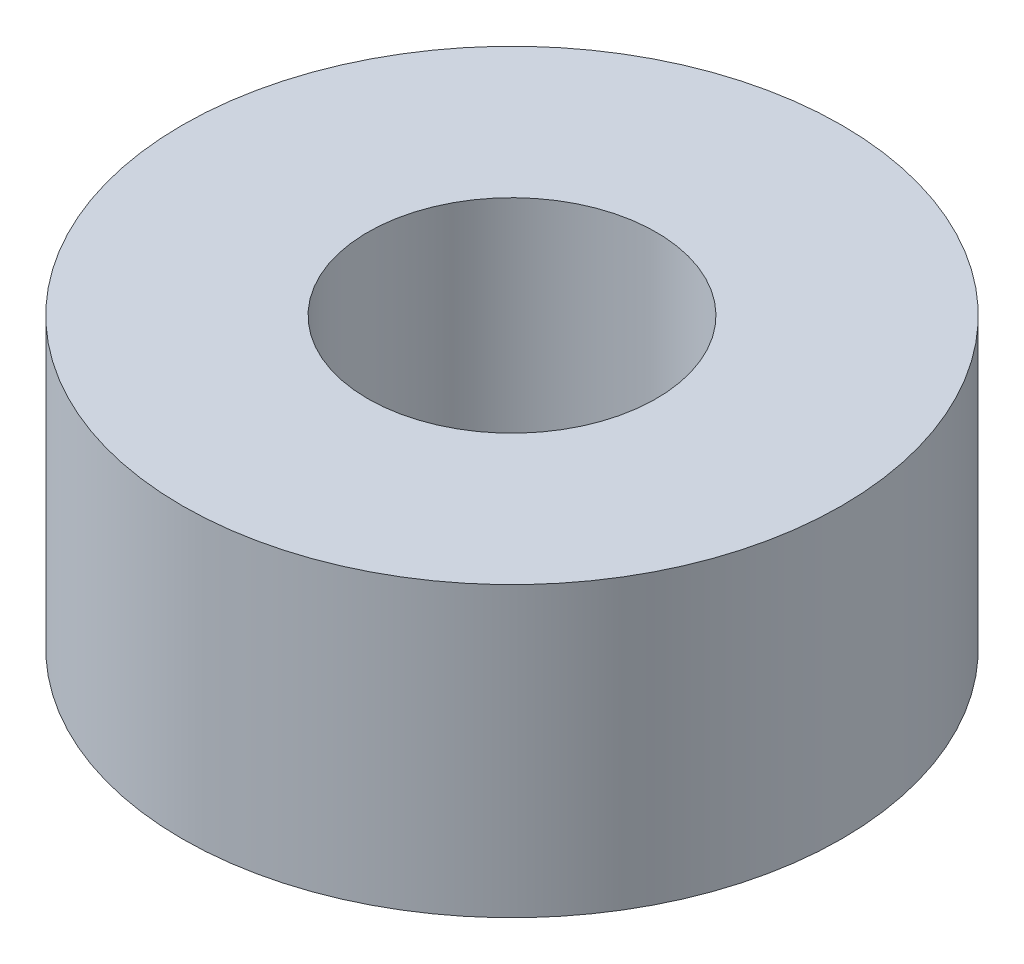
ISO-10303-21;
HEADER;
FILE_DESCRIPTION(('STEP AP214'),'2;1');
FILE_NAME('part.step','',(''),(''),'','','');
FILE_SCHEMA(('AUTOMOTIVE_DESIGN { 1 0 10303 214 1 1 1 1 }'));
ENDSEC;
DATA;
#1=APPLICATION_CONTEXT('core data for automotive mechanical design processes');
#2=APPLICATION_PROTOCOL_DEFINITION('international standard','automotive_design',2000,#1);
#3=PRODUCT_CONTEXT('',#1,'mechanical');
#4=PRODUCT('Part','Part','',(#3));
#5=PRODUCT_RELATED_PRODUCT_CATEGORY('part','',(#4));
#6=PRODUCT_DEFINITION_FORMATION('','',#4);
#7=PRODUCT_DEFINITION_CONTEXT('part definition',#1,'design');
#8=PRODUCT_DEFINITION('design','',#6,#7);
#9=PRODUCT_DEFINITION_SHAPE('','',#8);
#10=(LENGTH_UNIT() NAMED_UNIT(*) SI_UNIT(.MILLI.,.METRE.));
#11=(NAMED_UNIT(*) PLANE_ANGLE_UNIT() SI_UNIT($,.RADIAN.));
#12=(NAMED_UNIT(*) SI_UNIT($,.STERADIAN.) SOLID_ANGLE_UNIT());
#13=UNCERTAINTY_MEASURE_WITH_UNIT(LENGTH_MEASURE(1.E-05),#10,'distance_accuracy_value','');
#14=(GEOMETRIC_REPRESENTATION_CONTEXT(3) GLOBAL_UNCERTAINTY_ASSIGNED_CONTEXT((#13)) GLOBAL_UNIT_ASSIGNED_CONTEXT((#10,
#11,#12)) REPRESENTATION_CONTEXT('',''));
#15=CARTESIAN_POINT('',(0.,0.,0.));
#16=DIRECTION('',(0.,0.,1.));
#17=DIRECTION('',(1.,0.,0.));
#18=AXIS2_PLACEMENT_3D('',#15,#16,#17);
#19=CARTESIAN_POINT('',(0.,3.5,0.));
#20=DIRECTION('',(0.,-1.,0.));
#21=DIRECTION('',(0.,0.,-1.));
#22=AXIS2_PLACEMENT_3D('',#19,#20,#21);
#23=CYLINDRICAL_SURFACE('',#22,1.75);
#24=CARTESIAN_POINT('',(0.,3.5,0.));
#25=DIRECTION('',(0.,1.,0.));
#26=DIRECTION('',(0.,0.,1.));
#27=AXIS2_PLACEMENT_3D('',#24,#25,#26);
#28=CIRCLE('',#27,1.75);
#29=CARTESIAN_POINT('',(0.,3.5,1.75));
#30=VERTEX_POINT('',#29);
#31=EDGE_CURVE('E38',#30,#30,#28,.T.);
#32=ORIENTED_EDGE('',*,*,#31,.T.);
#33=EDGE_LOOP('',(#32));
#34=FACE_BOUND('',#33,.T.);
#35=CARTESIAN_POINT('',(0.,0.,0.));
#36=DIRECTION('',(0.,1.,0.));
#37=DIRECTION('',(0.,0.,1.));
#38=AXIS2_PLACEMENT_3D('',#35,#36,#37);
#39=CIRCLE('',#38,1.75);
#40=CARTESIAN_POINT('',(0.,0.,1.75));
#41=VERTEX_POINT('',#40);
#42=EDGE_CURVE('E44',#41,#41,#39,.T.);
#43=ORIENTED_EDGE('',*,*,#42,.F.);
#44=EDGE_LOOP('',(#43));
#45=FACE_BOUND('',#44,.T.);
#46=ADVANCED_FACE('F31',(#34,#45),#23,.F.);
#47=CARTESIAN_POINT('',(0.,3.5,0.));
#48=DIRECTION('',(0.,-1.,0.));
#49=DIRECTION('',(0.,0.,-1.));
#50=AXIS2_PLACEMENT_3D('',#47,#48,#49);
#51=CYLINDRICAL_SURFACE('',#50,4.);
#52=CARTESIAN_POINT('',(0.,3.5,0.));
#53=DIRECTION('',(0.,1.,0.));
#54=DIRECTION('',(0.,0.,1.));
#55=AXIS2_PLACEMENT_3D('',#52,#53,#54);
#56=CIRCLE('',#55,4.);
#57=CARTESIAN_POINT('',(0.,3.5,4.));
#58=VERTEX_POINT('',#57);
#59=EDGE_CURVE('E10',#58,#58,#56,.T.);
#60=ORIENTED_EDGE('',*,*,#59,.F.);
#61=EDGE_LOOP('',(#60));
#62=FACE_BOUND('',#61,.T.);
#63=CARTESIAN_POINT('',(0.,0.,0.));
#64=DIRECTION('',(0.,1.,0.));
#65=DIRECTION('',(0.,0.,1.));
#66=AXIS2_PLACEMENT_3D('',#63,#64,#65);
#67=CIRCLE('',#66,4.);
#68=CARTESIAN_POINT('',(0.,0.,4.));
#69=VERTEX_POINT('',#68);
#70=EDGE_CURVE('E34',#69,#69,#67,.T.);
#71=ORIENTED_EDGE('',*,*,#70,.T.);
#72=EDGE_LOOP('',(#71));
#73=FACE_BOUND('',#72,.T.);
#74=ADVANCED_FACE('F51',(#62,#73),#51,.T.);
#75=CARTESIAN_POINT('',(0.,3.5,0.));
#76=DIRECTION('',(0.,1.,0.));
#77=DIRECTION('',(0.,0.,1.));
#78=AXIS2_PLACEMENT_3D('',#75,#76,#77);
#79=PLANE('',#78);
#80=ORIENTED_EDGE('',*,*,#31,.F.);
#81=EDGE_LOOP('',(#80));
#82=FACE_BOUND('',#81,.T.);
#83=ORIENTED_EDGE('',*,*,#59,.T.);
#84=EDGE_LOOP('',(#83));
#85=FACE_BOUND('',#84,.T.);
#86=ADVANCED_FACE('F55',(#82,#85),#79,.T.);
#87=CARTESIAN_POINT('',(0.,0.,0.));
#88=DIRECTION('',(0.,1.,0.));
#89=DIRECTION('',(0.,0.,1.));
#90=AXIS2_PLACEMENT_3D('',#87,#88,#89);
#91=PLANE('',#90);
#92=ORIENTED_EDGE('',*,*,#42,.T.);
#93=EDGE_LOOP('',(#92));
#94=FACE_BOUND('',#93,.T.);
#95=ORIENTED_EDGE('',*,*,#70,.F.);
#96=EDGE_LOOP('',(#95));
#97=FACE_BOUND('',#96,.T.);
#98=ADVANCED_FACE('F53',(#94,#97),#91,.F.);
#99=CLOSED_SHELL('',(#46,#74,#86,#98));
#100=MANIFOLD_SOLID_BREP('B2',#99);
#101=ADVANCED_BREP_SHAPE_REPRESENTATION('',(#18,#100),#14);
#102=SHAPE_DEFINITION_REPRESENTATION(#9,#101);
ENDSEC;
END-ISO-10303-21;
